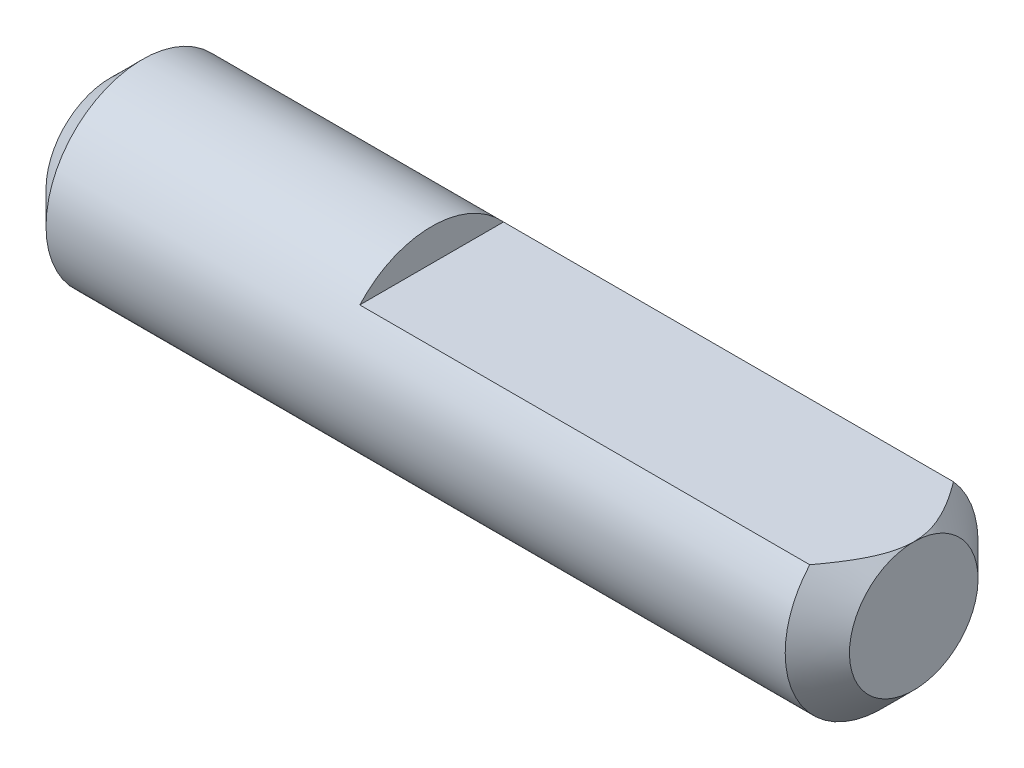
ISO-10303-21;
HEADER;
FILE_DESCRIPTION(('STEP AP214'),'2;1');
FILE_NAME('part.step','',(''),(''),'','','');
FILE_SCHEMA(('AUTOMOTIVE_DESIGN { 1 0 10303 214 1 1 1 1 }'));
ENDSEC;
DATA;
#1=APPLICATION_CONTEXT('core data for automotive mechanical design processes');
#2=APPLICATION_PROTOCOL_DEFINITION('international standard','automotive_design',2000,#1);
#3=PRODUCT_CONTEXT('',#1,'mechanical');
#4=PRODUCT('Part','Part','',(#3));
#5=PRODUCT_RELATED_PRODUCT_CATEGORY('part','',(#4));
#6=PRODUCT_DEFINITION_FORMATION('','',#4);
#7=PRODUCT_DEFINITION_CONTEXT('part definition',#1,'design');
#8=PRODUCT_DEFINITION('design','',#6,#7);
#9=PRODUCT_DEFINITION_SHAPE('','',#8);
#10=(LENGTH_UNIT() NAMED_UNIT(*) SI_UNIT(.MILLI.,.METRE.));
#11=(NAMED_UNIT(*) PLANE_ANGLE_UNIT() SI_UNIT($,.RADIAN.));
#12=(NAMED_UNIT(*) SI_UNIT($,.STERADIAN.) SOLID_ANGLE_UNIT());
#13=UNCERTAINTY_MEASURE_WITH_UNIT(LENGTH_MEASURE(1.E-05),#10,'distance_accuracy_value','');
#14=(GEOMETRIC_REPRESENTATION_CONTEXT(3) GLOBAL_UNCERTAINTY_ASSIGNED_CONTEXT((#13)) GLOBAL_UNIT_ASSIGNED_CONTEXT((#10,
#11,#12)) REPRESENTATION_CONTEXT('',''));
#15=CARTESIAN_POINT('',(0.,0.,0.));
#16=DIRECTION('',(0.,0.,1.));
#17=DIRECTION('',(1.,0.,0.));
#18=AXIS2_PLACEMENT_3D('',#15,#16,#17);
#19=CARTESIAN_POINT('',(-12.5,0.,0.));
#20=DIRECTION('',(-1.,0.,0.));
#21=DIRECTION('',(0.,0.,1.));
#22=AXIS2_PLACEMENT_3D('',#19,#20,#21);
#23=PLANE('',#22);
#24=CARTESIAN_POINT('',(-12.5,0.,0.));
#25=DIRECTION('',(-1.,0.,0.));
#26=DIRECTION('',(0.,0.,1.));
#27=AXIS2_PLACEMENT_3D('',#24,#25,#26);
#28=CIRCLE('',#27,1.99999999999999);
#29=CARTESIAN_POINT('',(-12.5,0.,1.99999999999999));
#30=VERTEX_POINT('',#29);
#31=EDGE_CURVE('E87',#30,#30,#28,.T.);
#32=ORIENTED_EDGE('',*,*,#31,.T.);
#33=EDGE_LOOP('',(#32));
#34=FACE_BOUND('',#33,.T.);
#35=ADVANCED_FACE('F41',(#34),#23,.T.);
#36=CARTESIAN_POINT('',(12.5,0.,0.));
#37=DIRECTION('',(-1.,0.,0.));
#38=DIRECTION('',(0.,0.,1.));
#39=AXIS2_PLACEMENT_3D('',#36,#37,#38);
#40=PLANE('',#39);
#41=CARTESIAN_POINT('',(12.5,0.,0.));
#42=DIRECTION('',(-1.,0.,0.));
#43=DIRECTION('',(0.,0.,1.));
#44=AXIS2_PLACEMENT_3D('',#41,#42,#43);
#45=CIRCLE('',#44,1.99999999999999);
#46=CARTESIAN_POINT('',(12.5,2.,0.));
#47=VERTEX_POINT('',#46);
#48=EDGE_CURVE('E95',#47,#47,#45,.F.);
#49=ORIENTED_EDGE('',*,*,#48,.T.);
#50=EDGE_LOOP('',(#49));
#51=FACE_BOUND('',#50,.T.);
#52=ADVANCED_FACE('F110',(#51),#40,.F.);
#53=CARTESIAN_POINT('',(-12.5,0.,0.));
#54=DIRECTION('',(-1.,0.,0.));
#55=DIRECTION('',(0.,0.,1.));
#56=AXIS2_PLACEMENT_3D('',#53,#54,#55);
#57=CYLINDRICAL_SURFACE('',#56,3.);
#58=DIRECTION('',(-1.,0.,0.));
#59=VECTOR('',#58,1.);
#60=CARTESIAN_POINT('',(-12.5,2.,-2.23606797749979));
#61=LINE('',#60,#59);
#62=CARTESIAN_POINT('',(11.4999999999999,2.,-2.23606797749999));
#63=VERTEX_POINT('',#62);
#64=CARTESIAN_POINT('',(-2.5,2.,-2.23606797749979));
#65=VERTEX_POINT('',#64);
#66=EDGE_CURVE('E75',#63,#65,#61,.T.);
#67=ORIENTED_EDGE('',*,*,#66,.F.);
#68=CARTESIAN_POINT('',(11.5,0.,0.));
#69=DIRECTION('',(-1.,0.,0.));
#70=DIRECTION('',(0.,0.,1.));
#71=AXIS2_PLACEMENT_3D('',#68,#69,#70);
#72=CIRCLE('',#71,3.);
#73=CARTESIAN_POINT('',(11.4999999999996,2.,2.23606797750084));
#74=VERTEX_POINT('',#73);
#75=EDGE_CURVE('E90',#63,#74,#72,.T.);
#76=ORIENTED_EDGE('',*,*,#75,.T.);
#77=DIRECTION('',(-1.,0.,0.));
#78=VECTOR('',#77,1.);
#79=CARTESIAN_POINT('',(-12.5,2.,2.23606797749979));
#80=LINE('',#79,#78);
#81=CARTESIAN_POINT('',(-2.5,2.,2.23606797749979));
#82=VERTEX_POINT('',#81);
#83=EDGE_CURVE('E62',#82,#74,#80,.F.);
#84=ORIENTED_EDGE('',*,*,#83,.F.);
#85=CARTESIAN_POINT('',(-2.5,0.,0.));
#86=DIRECTION('',(-1.,0.,0.));
#87=DIRECTION('',(0.,0.,1.));
#88=AXIS2_PLACEMENT_3D('',#85,#86,#87);
#89=CIRCLE('',#88,3.);
#90=EDGE_CURVE('E11',#65,#82,#89,.F.);
#91=ORIENTED_EDGE('',*,*,#90,.F.);
#92=EDGE_LOOP('',(#67,#76,#84,#91));
#93=FACE_BOUND('',#92,.T.);
#94=CARTESIAN_POINT('',(-11.5,0.,0.));
#95=DIRECTION('',(-1.,0.,0.));
#96=DIRECTION('',(0.,0.,1.));
#97=AXIS2_PLACEMENT_3D('',#94,#95,#96);
#98=CIRCLE('',#97,3.);
#99=CARTESIAN_POINT('',(-11.5,0.,3.));
#100=VERTEX_POINT('',#99);
#101=EDGE_CURVE('E92',#100,#100,#98,.F.);
#102=ORIENTED_EDGE('',*,*,#101,.T.);
#103=EDGE_LOOP('',(#102));
#104=FACE_BOUND('',#103,.T.);
#105=ADVANCED_FACE('F72',(#93,#104),#57,.T.);
#106=CARTESIAN_POINT('',(-12.5,0.,0.));
#107=DIRECTION('',(1.,0.,0.));
#108=DIRECTION('',(0.,0.,-1.));
#109=AXIS2_PLACEMENT_3D('',#106,#107,#108);
#110=CONICAL_SURFACE('',#109,1.99999999999999,0.785398163397446);
#111=ORIENTED_EDGE('',*,*,#101,.F.);
#112=EDGE_LOOP('',(#111));
#113=FACE_BOUND('',#112,.T.);
#114=ORIENTED_EDGE('',*,*,#31,.F.);
#115=EDGE_LOOP('',(#114));
#116=FACE_BOUND('',#115,.T.);
#117=ADVANCED_FACE('F109',(#113,#116),#110,.T.);
#118=CARTESIAN_POINT('',(11.5,0.,0.));
#119=DIRECTION('',(-1.,0.,0.));
#120=DIRECTION('',(0.,0.,1.));
#121=AXIS2_PLACEMENT_3D('',#118,#119,#120);
#122=CONICAL_SURFACE('',#121,3.,0.78539816339745);
#123=CARTESIAN_POINT('',(5.41703746970178,2.,8.86003432988845));
#124=CARTESIAN_POINT('',(5.65772775587966,2.,8.61326628181268));
#125=CARTESIAN_POINT('',(5.89818932126684,2.,8.36627412238222));
#126=CARTESIAN_POINT('',(6.37847537945591,2.,7.87164272525134));
#127=CARTESIAN_POINT('',(6.6182998334215,2.,7.62400344985071));
#128=CARTESIAN_POINT('',(7.09766753113925,2.,7.12732372928553));
#129=CARTESIAN_POINT('',(7.33720877992833,2.,6.87828135734135));
#130=CARTESIAN_POINT('',(7.81511816843588,2.,6.37909579449285));
#131=CARTESIAN_POINT('',(8.05348636554827,2.,6.12895265860308));
#132=CARTESIAN_POINT('',(8.53862729701263,2.,5.61649990414109));
#133=CARTESIAN_POINT('',(8.7853291560252,2.,5.35412312822613));
#134=CARTESIAN_POINT('',(9.27611212193805,2.,4.82684278662519));
#135=CARTESIAN_POINT('',(9.52019282034569,2.,4.56193883890144));
#136=CARTESIAN_POINT('',(9.88292375229358,2.,4.16179105350155));
#137=CARTESIAN_POINT('',(10.0031996958733,2.,4.02802218949267));
#138=CARTESIAN_POINT('',(10.2423168430769,2.,3.75920971084084));
#139=CARTESIAN_POINT('',(10.3611580738999,2.,3.62416612045073));
#140=CARTESIAN_POINT('',(10.5968866585208,2.,3.35244082891347));
#141=CARTESIAN_POINT('',(10.7137744962098,2.,3.21575954830017));
#142=CARTESIAN_POINT('',(10.9448790700268,2.,2.94016178485181));
#143=CARTESIAN_POINT('',(11.0590960369023,2.,2.80124549687175));
#144=CARTESIAN_POINT('',(11.2134470954143,2.,2.60814461422931));
#145=CARTESIAN_POINT('',(11.2552476939882,2.,2.55529185212358));
#146=CARTESIAN_POINT('',(11.3382090653509,2.,2.44908586095818));
#147=CARTESIAN_POINT('',(11.3793698296002,2.,2.39573262523426));
#148=CARTESIAN_POINT('',(11.5017621522644,2.,2.23479455060442));
#149=CARTESIAN_POINT('',(11.5818831700971,2.,2.12635689306305));
#150=CARTESIAN_POINT('',(11.7378134006537,2.,1.90673708759311));
#151=CARTESIAN_POINT('',(11.8136310124631,2.,1.79556093890677));
#152=CARTESIAN_POINT('',(11.9592648130628,2.,1.56934886975337));
#153=CARTESIAN_POINT('',(12.0290838591124,2.,1.45431482360752));
#154=CARTESIAN_POINT('',(12.130385368316,2.,1.27198493066234));
#155=CARTESIAN_POINT('',(12.1650047648803,2.,1.20644698594879));
#156=CARTESIAN_POINT('',(12.230766898565,2.,1.07366673449259));
#157=CARTESIAN_POINT('',(12.2619093348087,2.,1.00642428086809));
#158=CARTESIAN_POINT('',(12.348677331037,2.,0.802077686015743));
#159=CARTESIAN_POINT('',(12.3978656324703,2.,0.661975190878664));
#160=CARTESIAN_POINT('',(12.4482825520442,2.,0.461135646716724));
#161=CARTESIAN_POINT('',(12.4605900319976,2.,0.403129036486597));
#162=CARTESIAN_POINT('',(12.4804283252132,2.,0.28631420468672));
#163=CARTESIAN_POINT('',(12.4879614987479,2.,0.227506393918163));
#164=CARTESIAN_POINT('',(12.4978620338104,2.,0.109558488665088));
#165=CARTESIAN_POINT('',(12.5002385683149,2.,0.0504191721513691));
#166=CARTESIAN_POINT('',(12.4997235027777,2.,-0.0678384914660358));
#167=CARTESIAN_POINT('',(12.4968317495754,2.,-0.126956837910099));
#168=CARTESIAN_POINT('',(12.4859567501784,2.,-0.244510879048098));
#169=CARTESIAN_POINT('',(12.4779910262056,2.,-0.302948221036442));
#170=CARTESIAN_POINT('',(12.457380920399,2.,-0.41899444563337));
#171=CARTESIAN_POINT('',(12.4447354297561,2.,-0.476603128538789));
#172=CARTESIAN_POINT('',(12.4152693597724,2.,-0.590898805262331));
#173=CARTESIAN_POINT('',(12.3984374104437,2.,-0.64758283355783));
#174=CARTESIAN_POINT('',(12.3612099218623,2.,-0.759751791832215));
#175=CARTESIAN_POINT('',(12.3408145343484,2.,-0.815236772756141));
#176=CARTESIAN_POINT('',(12.2879608282142,2.,-0.947727233807935));
#177=CARTESIAN_POINT('',(12.2540040015544,2.,-1.02413301767514));
#178=CARTESIAN_POINT('',(12.1814592727722,2.,-1.17472930717663));
#179=CARTESIAN_POINT('',(12.142868803118,2.,-1.24891855591839));
#180=CARTESIAN_POINT('',(12.062053667377,2.,-1.3954657814648));
#181=CARTESIAN_POINT('',(12.0198220005083,2.,-1.46781986812049));
#182=CARTESIAN_POINT('',(11.932588859845,2.,-1.61084154933759));
#183=CARTESIAN_POINT('',(11.8875869724692,2.,-1.6815088898794));
#184=CARTESIAN_POINT('',(11.7947414327508,2.,-1.82243628031244));
#185=CARTESIAN_POINT('',(11.7468657769217,2.,-1.8926751476593));
#186=CARTESIAN_POINT('',(11.6493489269364,2.,-2.03191523170228));
#187=CARTESIAN_POINT('',(11.5997076704431,2.,-2.10091640457012));
#188=CARTESIAN_POINT('',(11.4990773821634,2.,-2.23778591963137));
#189=CARTESIAN_POINT('',(11.4480902132908,2.,-2.30565563523325));
#190=CARTESIAN_POINT('',(11.3449692411205,2.,-2.44051239160787));
#191=CARTESIAN_POINT('',(11.292835476495,2.,-2.50749946202879));
#192=CARTESIAN_POINT('',(11.1232507476965,2.,-2.72226884836498));
#193=CARTESIAN_POINT('',(11.0039525442269,2.,-2.86859218788451));
#194=CARTESIAN_POINT('',(10.7622538964127,2.,-3.15866002674973));
#195=CARTESIAN_POINT('',(10.6398531075473,2.,-3.30240423664722));
#196=CARTESIAN_POINT('',(10.3928234816083,2.,-3.58804149156583));
#197=CARTESIAN_POINT('',(10.2681939474629,2.,-3.72993393254005));
#198=CARTESIAN_POINT('',(10.017329582773,2.,-4.01229443801337));
#199=CARTESIAN_POINT('',(9.89109471582817,2.,-4.15276247008415));
#200=CARTESIAN_POINT('',(9.5101641473369,2.,-4.57303156086122));
#201=CARTESIAN_POINT('',(9.25367422062177,2.,-4.85120466112473));
#202=CARTESIAN_POINT('',(8.73787881132942,2.,-5.40481331464448));
#203=CARTESIAN_POINT('',(8.47857388539581,2.,-5.68024938921235));
#204=CARTESIAN_POINT('',(7.98660997655898,2.,-6.19921659830033));
#205=CARTESIAN_POINT('',(7.75414738426389,2.,-6.44293407084752));
#206=CARTESIAN_POINT('',(7.28813095964181,2.,-6.92935046958473));
#207=CARTESIAN_POINT('',(7.05457706255781,2.,-7.17204933366686));
#208=CARTESIAN_POINT('',(6.58735875199387,2.,-7.65596926208179));
#209=CARTESIAN_POINT('',(6.35369666350206,2.,-7.89719257267554));
#210=CARTESIAN_POINT('',(5.88577496049427,2.,-8.37902662777462));
#211=CARTESIAN_POINT('',(5.65151538850262,2.,-8.61963741356644));
#212=CARTESIAN_POINT('',(5.41703746970178,2.,-8.86003432988845));
#213=B_SPLINE_CURVE_WITH_KNOTS('',3,(#123,#124,#125,#126,#127,#128,#129,#130,#131,#132,#133,
#134,#135,#136,#137,#138,#139,#140,#141,#142,#143,#144,#145,#146,#147,#148,#149,#150,#151,#152,
#153,#154,#155,#156,#157,#158,#159,#160,#161,#162,#163,#164,#165,#166,#167,#168,#169,#170,#171,
#172,#173,#174,#175,#176,#177,#178,#179,#180,#181,#182,#183,#184,#185,#186,#187,#188,#189,#190,
#191,#192,#193,#194,#195,#196,#197,#198,#199,#200,#201,#202,#203,#204,#205,#206,#207,#208,#209,
#210,#211,#212),.UNSPECIFIED.,.F.,.F.,(4,2,2,2,2,2,2,2,2,2,2,2,2,2,2,2,2,2,2,2,2,2,2,2,2,2,2,2,
2,2,2,2,2,2,2,2,2,2,2,2,2,2,2,2,4),(0.,1.03413662075917,2.06833489563741,3.10497064258256,
4.14155515546503,5.22197638861575,6.30256362442557,6.84222642641263,7.3818789814386,
7.92139581157559,8.46086585711346,8.66301571388498,8.86516826629999,9.26957174594646,
9.67315669128106,10.076548321242,10.2988071281946,10.5210851533016,10.9643291236505,
11.1420628138381,11.3197085691929,11.4970380563588,11.6743726989632,11.8510982379089,
12.0278656764793,12.2051185420217,12.382363861591,12.6329835111957,12.8837426772573,
13.1349952037894,13.3862853325664,13.6412618216769,13.896247322065,14.150896697606,
14.4055374975173,14.9718400725797,15.538205809547,16.1047518958526,16.6713108514056,
17.8063943211659,18.9412572839372,19.9516651237309,20.962133701529,21.9696442456258,
22.9770849794664),.UNSPECIFIED.);
#214=EDGE_CURVE('E51',#74,#47,#213,.T.);
#215=ORIENTED_EDGE('',*,*,#214,.F.);
#216=ORIENTED_EDGE('',*,*,#75,.F.);
#217=EDGE_CURVE('E81',#47,#63,#213,.T.);
#218=ORIENTED_EDGE('',*,*,#217,.F.);
#219=ORIENTED_EDGE('',*,*,#48,.F.);
#220=EDGE_LOOP('',(#215,#216,#218,#219));
#221=FACE_BOUND('',#220,.T.);
#222=ADVANCED_FACE('F44',(#221),#122,.T.);
#223=CARTESIAN_POINT('',(12.5,2.,-3.));
#224=DIRECTION('',(0.,-1.,0.));
#225=DIRECTION('',(1.,0.,0.));
#226=AXIS2_PLACEMENT_3D('',#223,#224,#225);
#227=PLANE('',#226);
#228=ORIENTED_EDGE('',*,*,#83,.T.);
#229=ORIENTED_EDGE('',*,*,#214,.T.);
#230=ORIENTED_EDGE('',*,*,#217,.T.);
#231=ORIENTED_EDGE('',*,*,#66,.T.);
#232=DIRECTION('',(0.,0.,1.));
#233=VECTOR('',#232,1.);
#234=CARTESIAN_POINT('',(-2.5,2.,-3.));
#235=LINE('',#234,#233);
#236=EDGE_CURVE('E80',#65,#82,#235,.T.);
#237=ORIENTED_EDGE('',*,*,#236,.T.);
#238=EDGE_LOOP('',(#228,#229,#230,#231,#237));
#239=FACE_BOUND('',#238,.T.);
#240=ADVANCED_FACE('F79',(#239),#227,.F.);
#241=CARTESIAN_POINT('',(-2.5,2.,-3.));
#242=DIRECTION('',(-1.,0.,0.));
#243=DIRECTION('',(0.,0.,1.));
#244=AXIS2_PLACEMENT_3D('',#241,#242,#243);
#245=PLANE('',#244);
#246=ORIENTED_EDGE('',*,*,#236,.F.);
#247=ORIENTED_EDGE('',*,*,#90,.T.);
#248=EDGE_LOOP('',(#246,#247));
#249=FACE_BOUND('',#248,.T.);
#250=ADVANCED_FACE('F83',(#249),#245,.F.);
#251=CLOSED_SHELL('',(#35,#52,#105,#117,#222,#240,#250));
#252=MANIFOLD_SOLID_BREP('B2',#251);
#253=ADVANCED_BREP_SHAPE_REPRESENTATION('',(#18,#252),#14);
#254=SHAPE_DEFINITION_REPRESENTATION(#9,#253);
ENDSEC;
END-ISO-10303-21;
